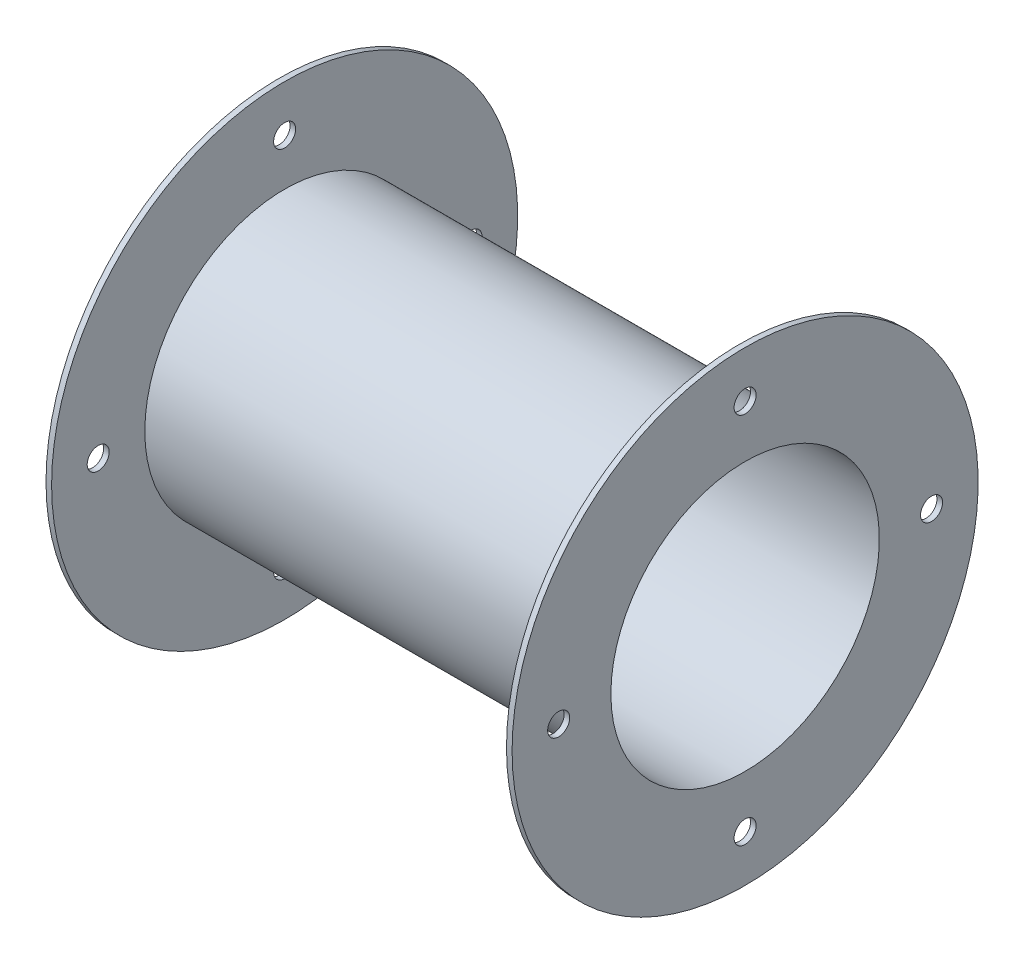
ISO-10303-21;
HEADER;
FILE_DESCRIPTION(('STEP AP214'),'2;1');
FILE_NAME('part.step','',(''),(''),'','','');
FILE_SCHEMA(('AUTOMOTIVE_DESIGN { 1 0 10303 214 1 1 1 1 }'));
ENDSEC;
DATA;
#1=APPLICATION_CONTEXT('core data for automotive mechanical design processes');
#2=APPLICATION_PROTOCOL_DEFINITION('international standard','automotive_design',2000,#1);
#3=PRODUCT_CONTEXT('',#1,'mechanical');
#4=PRODUCT('Part','Part','',(#3));
#5=PRODUCT_RELATED_PRODUCT_CATEGORY('part','',(#4));
#6=PRODUCT_DEFINITION_FORMATION('','',#4);
#7=PRODUCT_DEFINITION_CONTEXT('part definition',#1,'design');
#8=PRODUCT_DEFINITION('design','',#6,#7);
#9=PRODUCT_DEFINITION_SHAPE('','',#8);
#10=(LENGTH_UNIT() NAMED_UNIT(*) SI_UNIT(.MILLI.,.METRE.));
#11=(NAMED_UNIT(*) PLANE_ANGLE_UNIT() SI_UNIT($,.RADIAN.));
#12=(NAMED_UNIT(*) SI_UNIT($,.STERADIAN.) SOLID_ANGLE_UNIT());
#13=UNCERTAINTY_MEASURE_WITH_UNIT(LENGTH_MEASURE(1.E-05),#10,'distance_accuracy_value','');
#14=(GEOMETRIC_REPRESENTATION_CONTEXT(3) GLOBAL_UNCERTAINTY_ASSIGNED_CONTEXT((#13)) GLOBAL_UNIT_ASSIGNED_CONTEXT((#10,
#11,#12)) REPRESENTATION_CONTEXT('',''));
#15=CARTESIAN_POINT('',(0.,0.,0.));
#16=DIRECTION('',(0.,0.,1.));
#17=DIRECTION('',(1.,0.,0.));
#18=AXIS2_PLACEMENT_3D('',#15,#16,#17);
#19=CARTESIAN_POINT('',(-7.37458193979935,-36.576,0.));
#20=DIRECTION('',(-1.,0.,0.));
#21=DIRECTION('',(0.,0.,1.));
#22=AXIS2_PLACEMENT_3D('',#19,#20,#21);
#23=CYLINDRICAL_SURFACE('',#22,36.576);
#24=CARTESIAN_POINT('',(127.,-36.576,0.));
#25=DIRECTION('',(-1.,0.,0.));
#26=DIRECTION('',(0.,0.,1.));
#27=AXIS2_PLACEMENT_3D('',#24,#25,#26);
#28=CIRCLE('',#27,36.576);
#29=CARTESIAN_POINT('',(127.,-36.576,36.576));
#30=VERTEX_POINT('',#29);
#31=EDGE_CURVE('E69',#30,#30,#28,.T.);
#32=ORIENTED_EDGE('',*,*,#31,.F.);
#33=EDGE_LOOP('',(#32));
#34=FACE_BOUND('',#33,.T.);
#35=CARTESIAN_POINT('',(0.,-36.576,0.));
#36=DIRECTION('',(-1.,0.,0.));
#37=DIRECTION('',(0.,0.,1.));
#38=AXIS2_PLACEMENT_3D('',#35,#36,#37);
#39=CIRCLE('',#38,36.576);
#40=CARTESIAN_POINT('',(0.,-36.576,36.576));
#41=VERTEX_POINT('',#40);
#42=EDGE_CURVE('E10',#41,#41,#39,.T.);
#43=ORIENTED_EDGE('',*,*,#42,.T.);
#44=EDGE_LOOP('',(#43));
#45=FACE_BOUND('',#44,.T.);
#46=ADVANCED_FACE('F41',(#34,#45),#23,.F.);
#47=CARTESIAN_POINT('',(0.,0.,0.));
#48=DIRECTION('',(1.,0.,0.));
#49=DIRECTION('',(0.,0.,-1.));
#50=AXIS2_PLACEMENT_3D('',#47,#48,#49);
#51=PLANE('',#50);
#52=CARTESIAN_POINT('',(0.,-36.5760000000002,-50.8));
#53=DIRECTION('',(1.,0.,0.));
#54=DIRECTION('',(0.,0.,-1.));
#55=AXIS2_PLACEMENT_3D('',#52,#53,#54);
#56=CIRCLE('',#55,3.);
#57=CARTESIAN_POINT('',(0.,-36.5760000000002,-53.8));
#58=VERTEX_POINT('',#57);
#59=EDGE_CURVE('E84',#58,#58,#56,.T.);
#60=ORIENTED_EDGE('',*,*,#59,.T.);
#61=EDGE_LOOP('',(#60));
#62=FACE_BOUND('',#61,.T.);
#63=CARTESIAN_POINT('',(0.,-87.376,0.));
#64=DIRECTION('',(1.,0.,0.));
#65=DIRECTION('',(0.,0.,-1.));
#66=AXIS2_PLACEMENT_3D('',#63,#64,#65);
#67=CIRCLE('',#66,3.);
#68=CARTESIAN_POINT('',(0.,-87.376,-3.));
#69=VERTEX_POINT('',#68);
#70=EDGE_CURVE('E93',#69,#69,#67,.T.);
#71=ORIENTED_EDGE('',*,*,#70,.T.);
#72=EDGE_LOOP('',(#71));
#73=FACE_BOUND('',#72,.T.);
#74=CARTESIAN_POINT('',(0.,-36.5759999999995,50.8));
#75=DIRECTION('',(1.,0.,0.));
#76=DIRECTION('',(0.,0.,-1.));
#77=AXIS2_PLACEMENT_3D('',#74,#75,#76);
#78=CIRCLE('',#77,3.);
#79=CARTESIAN_POINT('',(0.,-36.5759999999995,47.8));
#80=VERTEX_POINT('',#79);
#81=EDGE_CURVE('E102',#80,#80,#78,.T.);
#82=ORIENTED_EDGE('',*,*,#81,.T.);
#83=EDGE_LOOP('',(#82));
#84=FACE_BOUND('',#83,.T.);
#85=CARTESIAN_POINT('',(0.,14.224,0.));
#86=DIRECTION('',(1.,0.,0.));
#87=DIRECTION('',(0.,0.,-1.));
#88=AXIS2_PLACEMENT_3D('',#85,#86,#87);
#89=CIRCLE('',#88,3.);
#90=CARTESIAN_POINT('',(0.,14.224,-3.));
#91=VERTEX_POINT('',#90);
#92=EDGE_CURVE('E72',#91,#91,#89,.T.);
#93=ORIENTED_EDGE('',*,*,#92,.T.);
#94=EDGE_LOOP('',(#93));
#95=FACE_BOUND('',#94,.T.);
#96=ORIENTED_EDGE('',*,*,#42,.F.);
#97=EDGE_LOOP('',(#96));
#98=FACE_BOUND('',#97,.T.);
#99=CARTESIAN_POINT('',(0.,-36.576,0.));
#100=DIRECTION('',(-1.,0.,0.));
#101=DIRECTION('',(0.,0.,1.));
#102=AXIS2_PLACEMENT_3D('',#99,#100,#101);
#103=CIRCLE('',#102,63.5);
#104=CARTESIAN_POINT('',(0.,-36.576,63.5));
#105=VERTEX_POINT('',#104);
#106=EDGE_CURVE('E47',#105,#105,#103,.T.);
#107=ORIENTED_EDGE('',*,*,#106,.T.);
#108=EDGE_LOOP('',(#107));
#109=FACE_BOUND('',#108,.T.);
#110=ADVANCED_FACE('F161',(#62,#73,#84,#95,#98,#109),#51,.F.);
#111=CARTESIAN_POINT('',(-7.37458193979935,-36.576,0.));
#112=DIRECTION('',(-1.,0.,0.));
#113=DIRECTION('',(0.,0.,1.));
#114=AXIS2_PLACEMENT_3D('',#111,#112,#113);
#115=CYLINDRICAL_SURFACE('',#114,63.5);
#116=ORIENTED_EDGE('',*,*,#106,.F.);
#117=EDGE_LOOP('',(#116));
#118=FACE_BOUND('',#117,.T.);
#119=CARTESIAN_POINT('',(1.524,-36.576,0.));
#120=DIRECTION('',(-1.,0.,0.));
#121=DIRECTION('',(0.,0.,1.));
#122=AXIS2_PLACEMENT_3D('',#119,#120,#121);
#123=CIRCLE('',#122,63.5);
#124=CARTESIAN_POINT('',(1.524,-36.576,63.5));
#125=VERTEX_POINT('',#124);
#126=EDGE_CURVE('E51',#125,#125,#123,.T.);
#127=ORIENTED_EDGE('',*,*,#126,.T.);
#128=EDGE_LOOP('',(#127));
#129=FACE_BOUND('',#128,.T.);
#130=ADVANCED_FACE('F165',(#118,#129),#115,.T.);
#131=CARTESIAN_POINT('',(1.524,26.924,0.));
#132=DIRECTION('',(-1.,0.,0.));
#133=DIRECTION('',(0.,0.,1.));
#134=AXIS2_PLACEMENT_3D('',#131,#132,#133);
#135=PLANE('',#134);
#136=CARTESIAN_POINT('',(1.524,-36.5760000000002,-50.8));
#137=DIRECTION('',(-1.,0.,0.));
#138=DIRECTION('',(0.,0.,1.));
#139=AXIS2_PLACEMENT_3D('',#136,#137,#138);
#140=CIRCLE('',#139,3.);
#141=CARTESIAN_POINT('',(1.524,-36.5760000000002,-47.8));
#142=VERTEX_POINT('',#141);
#143=EDGE_CURVE('E87',#142,#142,#140,.T.);
#144=ORIENTED_EDGE('',*,*,#143,.T.);
#145=EDGE_LOOP('',(#144));
#146=FACE_BOUND('',#145,.T.);
#147=CARTESIAN_POINT('',(1.524,-87.376,0.));
#148=DIRECTION('',(-1.,0.,0.));
#149=DIRECTION('',(0.,0.,1.));
#150=AXIS2_PLACEMENT_3D('',#147,#148,#149);
#151=CIRCLE('',#150,3.);
#152=CARTESIAN_POINT('',(1.524,-87.376,3.));
#153=VERTEX_POINT('',#152);
#154=EDGE_CURVE('E96',#153,#153,#151,.T.);
#155=ORIENTED_EDGE('',*,*,#154,.T.);
#156=EDGE_LOOP('',(#155));
#157=FACE_BOUND('',#156,.T.);
#158=CARTESIAN_POINT('',(1.524,-36.5759999999995,50.8));
#159=DIRECTION('',(-1.,0.,0.));
#160=DIRECTION('',(0.,0.,1.));
#161=AXIS2_PLACEMENT_3D('',#158,#159,#160);
#162=CIRCLE('',#161,3.);
#163=CARTESIAN_POINT('',(1.524,-36.5759999999995,53.8));
#164=VERTEX_POINT('',#163);
#165=EDGE_CURVE('E105',#164,#164,#162,.T.);
#166=ORIENTED_EDGE('',*,*,#165,.T.);
#167=EDGE_LOOP('',(#166));
#168=FACE_BOUND('',#167,.T.);
#169=CARTESIAN_POINT('',(1.524,14.224,0.));
#170=DIRECTION('',(-1.,0.,0.));
#171=DIRECTION('',(0.,0.,1.));
#172=AXIS2_PLACEMENT_3D('',#169,#170,#171);
#173=CIRCLE('',#172,3.);
#174=CARTESIAN_POINT('',(1.524,14.224,3.));
#175=VERTEX_POINT('',#174);
#176=EDGE_CURVE('E75',#175,#175,#173,.T.);
#177=ORIENTED_EDGE('',*,*,#176,.T.);
#178=EDGE_LOOP('',(#177));
#179=FACE_BOUND('',#178,.T.);
#180=ORIENTED_EDGE('',*,*,#126,.F.);
#181=EDGE_LOOP('',(#180));
#182=FACE_BOUND('',#181,.T.);
#183=CARTESIAN_POINT('',(1.524,-36.576,0.));
#184=DIRECTION('',(-1.,0.,0.));
#185=DIRECTION('',(0.,0.,1.));
#186=AXIS2_PLACEMENT_3D('',#183,#184,#185);
#187=CIRCLE('',#186,38.1);
#188=CARTESIAN_POINT('',(1.524,-36.576,38.1));
#189=VERTEX_POINT('',#188);
#190=EDGE_CURVE('E55',#189,#189,#187,.T.);
#191=ORIENTED_EDGE('',*,*,#190,.T.);
#192=EDGE_LOOP('',(#191));
#193=FACE_BOUND('',#192,.T.);
#194=ADVANCED_FACE('F170',(#146,#157,#168,#179,#182,#193),#135,.F.);
#195=CARTESIAN_POINT('',(-7.37458193979935,-36.576,0.));
#196=DIRECTION('',(-1.,0.,0.));
#197=DIRECTION('',(0.,0.,1.));
#198=AXIS2_PLACEMENT_3D('',#195,#196,#197);
#199=CYLINDRICAL_SURFACE('',#198,38.1);
#200=ORIENTED_EDGE('',*,*,#190,.F.);
#201=EDGE_LOOP('',(#200));
#202=FACE_BOUND('',#201,.T.);
#203=CARTESIAN_POINT('',(125.476,-36.576,0.));
#204=DIRECTION('',(-1.,0.,0.));
#205=DIRECTION('',(0.,0.,1.));
#206=AXIS2_PLACEMENT_3D('',#203,#204,#205);
#207=CIRCLE('',#206,38.1);
#208=CARTESIAN_POINT('',(125.476,-36.576,38.1));
#209=VERTEX_POINT('',#208);
#210=EDGE_CURVE('E60',#209,#209,#207,.T.);
#211=ORIENTED_EDGE('',*,*,#210,.T.);
#212=EDGE_LOOP('',(#211));
#213=FACE_BOUND('',#212,.T.);
#214=ADVANCED_FACE('F137',(#202,#213),#199,.T.);
#215=CARTESIAN_POINT('',(125.476,1.52399999999999,0.));
#216=DIRECTION('',(1.,0.,0.));
#217=DIRECTION('',(0.,0.,-1.));
#218=AXIS2_PLACEMENT_3D('',#215,#216,#217);
#219=PLANE('',#218);
#220=CARTESIAN_POINT('',(125.476,-36.5760000000002,-50.8));
#221=DIRECTION('',(1.,0.,0.));
#222=DIRECTION('',(0.,0.,-1.));
#223=AXIS2_PLACEMENT_3D('',#220,#221,#222);
#224=CIRCLE('',#223,3.);
#225=CARTESIAN_POINT('',(125.476,-36.5760000000002,-53.8));
#226=VERTEX_POINT('',#225);
#227=EDGE_CURVE('E90',#226,#226,#224,.T.);
#228=ORIENTED_EDGE('',*,*,#227,.T.);
#229=EDGE_LOOP('',(#228));
#230=FACE_BOUND('',#229,.T.);
#231=CARTESIAN_POINT('',(125.476,-87.376,0.));
#232=DIRECTION('',(1.,0.,0.));
#233=DIRECTION('',(0.,0.,-1.));
#234=AXIS2_PLACEMENT_3D('',#231,#232,#233);
#235=CIRCLE('',#234,3.);
#236=CARTESIAN_POINT('',(125.476,-87.376,-3.));
#237=VERTEX_POINT('',#236);
#238=EDGE_CURVE('E99',#237,#237,#235,.T.);
#239=ORIENTED_EDGE('',*,*,#238,.T.);
#240=EDGE_LOOP('',(#239));
#241=FACE_BOUND('',#240,.T.);
#242=CARTESIAN_POINT('',(125.476,-36.5759999999995,50.8));
#243=DIRECTION('',(1.,0.,0.));
#244=DIRECTION('',(0.,0.,-1.));
#245=AXIS2_PLACEMENT_3D('',#242,#243,#244);
#246=CIRCLE('',#245,3.);
#247=CARTESIAN_POINT('',(125.476,-36.5759999999995,47.8));
#248=VERTEX_POINT('',#247);
#249=EDGE_CURVE('E108',#248,#248,#246,.T.);
#250=ORIENTED_EDGE('',*,*,#249,.T.);
#251=EDGE_LOOP('',(#250));
#252=FACE_BOUND('',#251,.T.);
#253=CARTESIAN_POINT('',(125.476,14.224,0.));
#254=DIRECTION('',(1.,0.,0.));
#255=DIRECTION('',(0.,0.,-1.));
#256=AXIS2_PLACEMENT_3D('',#253,#254,#255);
#257=CIRCLE('',#256,3.);
#258=CARTESIAN_POINT('',(125.476,14.224,-3.));
#259=VERTEX_POINT('',#258);
#260=EDGE_CURVE('E78',#259,#259,#257,.T.);
#261=ORIENTED_EDGE('',*,*,#260,.T.);
#262=EDGE_LOOP('',(#261));
#263=FACE_BOUND('',#262,.T.);
#264=ORIENTED_EDGE('',*,*,#210,.F.);
#265=EDGE_LOOP('',(#264));
#266=FACE_BOUND('',#265,.T.);
#267=CARTESIAN_POINT('',(125.476,-36.576,0.));
#268=DIRECTION('',(-1.,0.,0.));
#269=DIRECTION('',(0.,0.,1.));
#270=AXIS2_PLACEMENT_3D('',#267,#268,#269);
#271=CIRCLE('',#270,63.5);
#272=CARTESIAN_POINT('',(125.476,-36.576,63.5));
#273=VERTEX_POINT('',#272);
#274=EDGE_CURVE('E63',#273,#273,#271,.T.);
#275=ORIENTED_EDGE('',*,*,#274,.T.);
#276=EDGE_LOOP('',(#275));
#277=FACE_BOUND('',#276,.T.);
#278=ADVANCED_FACE('F133',(#230,#241,#252,#263,#266,#277),#219,.F.);
#279=CARTESIAN_POINT('',(-7.37458193979935,-36.576,0.));
#280=DIRECTION('',(-1.,0.,0.));
#281=DIRECTION('',(0.,0.,1.));
#282=AXIS2_PLACEMENT_3D('',#279,#280,#281);
#283=CYLINDRICAL_SURFACE('',#282,63.5);
#284=ORIENTED_EDGE('',*,*,#274,.F.);
#285=EDGE_LOOP('',(#284));
#286=FACE_BOUND('',#285,.T.);
#287=CARTESIAN_POINT('',(127.,-36.576,0.));
#288=DIRECTION('',(-1.,0.,0.));
#289=DIRECTION('',(0.,0.,1.));
#290=AXIS2_PLACEMENT_3D('',#287,#288,#289);
#291=CIRCLE('',#290,63.5);
#292=CARTESIAN_POINT('',(127.,-36.576,63.5));
#293=VERTEX_POINT('',#292);
#294=EDGE_CURVE('E66',#293,#293,#291,.T.);
#295=ORIENTED_EDGE('',*,*,#294,.T.);
#296=EDGE_LOOP('',(#295));
#297=FACE_BOUND('',#296,.T.);
#298=ADVANCED_FACE('F136',(#286,#297),#283,.T.);
#299=CARTESIAN_POINT('',(127.,26.924,0.));
#300=DIRECTION('',(-1.,0.,0.));
#301=DIRECTION('',(0.,0.,1.));
#302=AXIS2_PLACEMENT_3D('',#299,#300,#301);
#303=PLANE('',#302);
#304=CARTESIAN_POINT('',(127.,-36.5760000000002,-50.8));
#305=DIRECTION('',(-1.,0.,0.));
#306=DIRECTION('',(0.,1.,0.));
#307=AXIS2_PLACEMENT_3D('',#304,#305,#306);
#308=CIRCLE('',#307,3.);
#309=CARTESIAN_POINT('',(127.,-33.5760000000002,-50.8));
#310=VERTEX_POINT('',#309);
#311=EDGE_CURVE('E111',#310,#310,#308,.T.);
#312=ORIENTED_EDGE('',*,*,#311,.T.);
#313=EDGE_LOOP('',(#312));
#314=FACE_BOUND('',#313,.T.);
#315=CARTESIAN_POINT('',(127.,-87.376,0.));
#316=DIRECTION('',(-1.,0.,0.));
#317=DIRECTION('',(0.,0.,-1.));
#318=AXIS2_PLACEMENT_3D('',#315,#316,#317);
#319=CIRCLE('',#318,3.);
#320=CARTESIAN_POINT('',(127.,-87.376,-3.));
#321=VERTEX_POINT('',#320);
#322=EDGE_CURVE('E115',#321,#321,#319,.T.);
#323=ORIENTED_EDGE('',*,*,#322,.T.);
#324=EDGE_LOOP('',(#323));
#325=FACE_BOUND('',#324,.T.);
#326=CARTESIAN_POINT('',(127.,-36.5759999999995,50.8));
#327=DIRECTION('',(-1.,0.,0.));
#328=DIRECTION('',(0.,-1.,0.));
#329=AXIS2_PLACEMENT_3D('',#326,#327,#328);
#330=CIRCLE('',#329,3.);
#331=CARTESIAN_POINT('',(127.,-39.5759999999995,50.8));
#332=VERTEX_POINT('',#331);
#333=EDGE_CURVE('E112',#332,#332,#330,.T.);
#334=ORIENTED_EDGE('',*,*,#333,.T.);
#335=EDGE_LOOP('',(#334));
#336=FACE_BOUND('',#335,.T.);
#337=CARTESIAN_POINT('',(127.,14.224,0.));
#338=DIRECTION('',(-1.,0.,0.));
#339=DIRECTION('',(0.,0.,1.));
#340=AXIS2_PLACEMENT_3D('',#337,#338,#339);
#341=CIRCLE('',#340,3.);
#342=CARTESIAN_POINT('',(127.,14.224,3.));
#343=VERTEX_POINT('',#342);
#344=EDGE_CURVE('E81',#343,#343,#341,.T.);
#345=ORIENTED_EDGE('',*,*,#344,.T.);
#346=EDGE_LOOP('',(#345));
#347=FACE_BOUND('',#346,.T.);
#348=ORIENTED_EDGE('',*,*,#294,.F.);
#349=EDGE_LOOP('',(#348));
#350=FACE_BOUND('',#349,.T.);
#351=ORIENTED_EDGE('',*,*,#31,.T.);
#352=EDGE_LOOP('',(#351));
#353=FACE_BOUND('',#352,.T.);
#354=ADVANCED_FACE('F121',(#314,#325,#336,#347,#350,#353),#303,.F.);
#355=CARTESIAN_POINT('',(127.,14.224,0.));
#356=DIRECTION('',(-1.,0.,0.));
#357=DIRECTION('',(0.,0.,1.));
#358=AXIS2_PLACEMENT_3D('',#355,#356,#357);
#359=CYLINDRICAL_SURFACE('',#358,3.);
#360=ORIENTED_EDGE('',*,*,#344,.F.);
#361=EDGE_LOOP('',(#360));
#362=FACE_BOUND('',#361,.T.);
#363=ORIENTED_EDGE('',*,*,#260,.F.);
#364=EDGE_LOOP('',(#363));
#365=FACE_BOUND('',#364,.T.);
#366=ADVANCED_FACE('F156',(#362,#365),#359,.F.);
#367=ORIENTED_EDGE('',*,*,#176,.F.);
#368=EDGE_LOOP('',(#367));
#369=FACE_BOUND('',#368,.T.);
#370=ORIENTED_EDGE('',*,*,#92,.F.);
#371=EDGE_LOOP('',(#370));
#372=FACE_BOUND('',#371,.T.);
#373=ADVANCED_FACE('F181',(#369,#372),#359,.F.);
#374=CARTESIAN_POINT('',(127.,-36.5759999999995,50.8));
#375=DIRECTION('',(-1.,0.,0.));
#376=DIRECTION('',(0.,0.,1.));
#377=AXIS2_PLACEMENT_3D('',#374,#375,#376);
#378=CYLINDRICAL_SURFACE('',#377,3.);
#379=ORIENTED_EDGE('',*,*,#333,.F.);
#380=EDGE_LOOP('',(#379));
#381=FACE_BOUND('',#380,.T.);
#382=ORIENTED_EDGE('',*,*,#249,.F.);
#383=EDGE_LOOP('',(#382));
#384=FACE_BOUND('',#383,.T.);
#385=ADVANCED_FACE('F184',(#381,#384),#378,.F.);
#386=CARTESIAN_POINT('',(127.,-87.376,0.));
#387=DIRECTION('',(-1.,0.,0.));
#388=DIRECTION('',(0.,0.,1.));
#389=AXIS2_PLACEMENT_3D('',#386,#387,#388);
#390=CYLINDRICAL_SURFACE('',#389,3.);
#391=ORIENTED_EDGE('',*,*,#322,.F.);
#392=EDGE_LOOP('',(#391));
#393=FACE_BOUND('',#392,.T.);
#394=ORIENTED_EDGE('',*,*,#238,.F.);
#395=EDGE_LOOP('',(#394));
#396=FACE_BOUND('',#395,.T.);
#397=ADVANCED_FACE('F128',(#393,#396),#390,.F.);
#398=CARTESIAN_POINT('',(127.,-36.5760000000002,-50.8));
#399=DIRECTION('',(-1.,0.,0.));
#400=DIRECTION('',(0.,0.,1.));
#401=AXIS2_PLACEMENT_3D('',#398,#399,#400);
#402=CYLINDRICAL_SURFACE('',#401,3.);
#403=ORIENTED_EDGE('',*,*,#311,.F.);
#404=EDGE_LOOP('',(#403));
#405=FACE_BOUND('',#404,.T.);
#406=ORIENTED_EDGE('',*,*,#227,.F.);
#407=EDGE_LOOP('',(#406));
#408=FACE_BOUND('',#407,.T.);
#409=ADVANCED_FACE('F124',(#405,#408),#402,.F.);
#410=ORIENTED_EDGE('',*,*,#165,.F.);
#411=EDGE_LOOP('',(#410));
#412=FACE_BOUND('',#411,.T.);
#413=ORIENTED_EDGE('',*,*,#81,.F.);
#414=EDGE_LOOP('',(#413));
#415=FACE_BOUND('',#414,.T.);
#416=ADVANCED_FACE('F127',(#412,#415),#378,.F.);
#417=ORIENTED_EDGE('',*,*,#154,.F.);
#418=EDGE_LOOP('',(#417));
#419=FACE_BOUND('',#418,.T.);
#420=ORIENTED_EDGE('',*,*,#70,.F.);
#421=EDGE_LOOP('',(#420));
#422=FACE_BOUND('',#421,.T.);
#423=ADVANCED_FACE('F188',(#419,#422),#390,.F.);
#424=ORIENTED_EDGE('',*,*,#143,.F.);
#425=EDGE_LOOP('',(#424));
#426=FACE_BOUND('',#425,.T.);
#427=ORIENTED_EDGE('',*,*,#59,.F.);
#428=EDGE_LOOP('',(#427));
#429=FACE_BOUND('',#428,.T.);
#430=ADVANCED_FACE('F130',(#426,#429),#402,.F.);
#431=CLOSED_SHELL('',(#46,#110,#130,#194,#214,#278,#298,#354,#366,#373,#385,#397,#409,#416,#423,#430));
#432=MANIFOLD_SOLID_BREP('B2',#431);
#433=ADVANCED_BREP_SHAPE_REPRESENTATION('',(#18,#432),#14);
#434=SHAPE_DEFINITION_REPRESENTATION(#9,#433);
ENDSEC;
END-ISO-10303-21;
